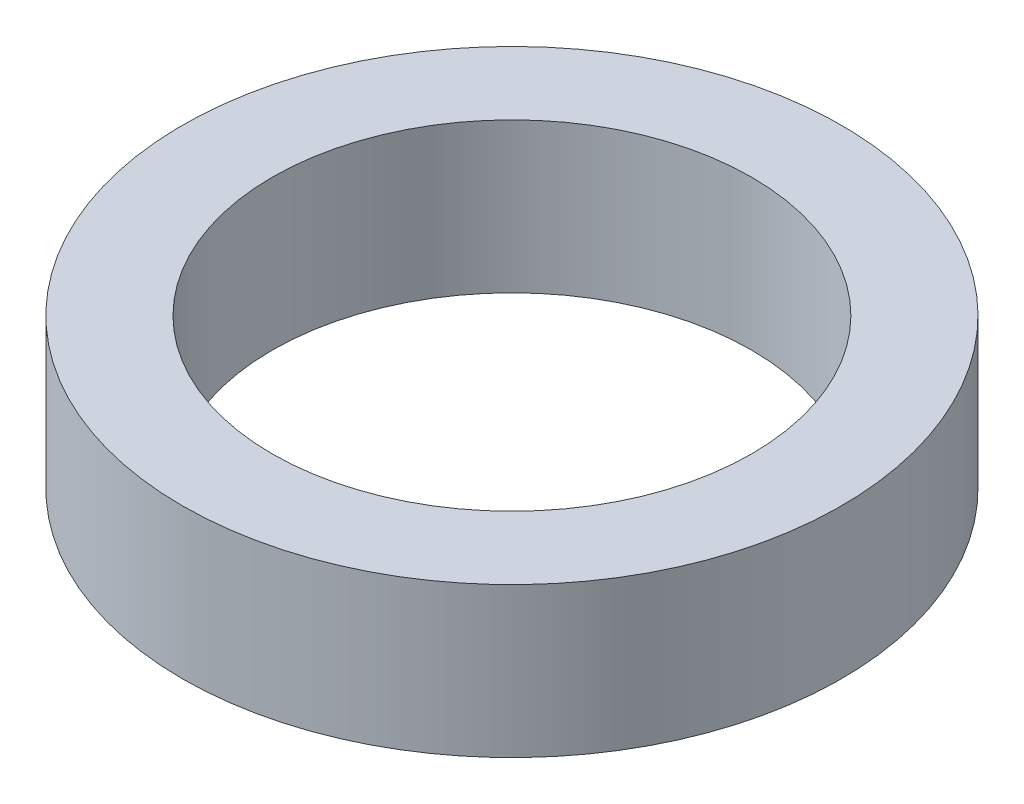
ISO-10303-21;
HEADER;
FILE_DESCRIPTION(('STEP AP214'),'2;1');
FILE_NAME('part.step','',(''),(''),'','','');
FILE_SCHEMA(('AUTOMOTIVE_DESIGN { 1 0 10303 214 1 1 1 1 }'));
ENDSEC;
DATA;
#1=APPLICATION_CONTEXT('core data for automotive mechanical design processes');
#2=APPLICATION_PROTOCOL_DEFINITION('international standard','automotive_design',2000,#1);
#3=PRODUCT_CONTEXT('',#1,'mechanical');
#4=PRODUCT('Part','Part','',(#3));
#5=PRODUCT_RELATED_PRODUCT_CATEGORY('part','',(#4));
#6=PRODUCT_DEFINITION_FORMATION('','',#4);
#7=PRODUCT_DEFINITION_CONTEXT('part definition',#1,'design');
#8=PRODUCT_DEFINITION('design','',#6,#7);
#9=PRODUCT_DEFINITION_SHAPE('','',#8);
#10=(LENGTH_UNIT() NAMED_UNIT(*) SI_UNIT(.MILLI.,.METRE.));
#11=(NAMED_UNIT(*) PLANE_ANGLE_UNIT() SI_UNIT($,.RADIAN.));
#12=(NAMED_UNIT(*) SI_UNIT($,.STERADIAN.) SOLID_ANGLE_UNIT());
#13=UNCERTAINTY_MEASURE_WITH_UNIT(LENGTH_MEASURE(1.E-05),#10,'distance_accuracy_value','');
#14=(GEOMETRIC_REPRESENTATION_CONTEXT(3) GLOBAL_UNCERTAINTY_ASSIGNED_CONTEXT((#13)) GLOBAL_UNIT_ASSIGNED_CONTEXT((#10,
#11,#12)) REPRESENTATION_CONTEXT('',''));
#15=CARTESIAN_POINT('',(0.,0.,0.));
#16=DIRECTION('',(0.,0.,1.));
#17=DIRECTION('',(1.,0.,0.));
#18=AXIS2_PLACEMENT_3D('',#15,#16,#17);
#19=CARTESIAN_POINT('',(0.,5.,0.));
#20=DIRECTION('',(0.,1.,0.));
#21=DIRECTION('',(0.,0.,1.));
#22=AXIS2_PLACEMENT_3D('',#19,#20,#21);
#23=PLANE('',#22);
#24=CARTESIAN_POINT('',(0.,5.,0.));
#25=DIRECTION('',(0.,1.,0.));
#26=DIRECTION('',(0.,0.,1.));
#27=AXIS2_PLACEMENT_3D('',#24,#25,#26);
#28=CIRCLE('',#27,11.);
#29=CARTESIAN_POINT('',(0.,5.,11.));
#30=VERTEX_POINT('',#29);
#31=EDGE_CURVE('E10',#30,#30,#28,.T.);
#32=ORIENTED_EDGE('',*,*,#31,.T.);
#33=EDGE_LOOP('',(#32));
#34=FACE_BOUND('',#33,.T.);
#35=CARTESIAN_POINT('',(0.,5.,0.));
#36=DIRECTION('',(0.,1.,0.));
#37=DIRECTION('',(0.,0.,1.));
#38=AXIS2_PLACEMENT_3D('',#35,#36,#37);
#39=CIRCLE('',#38,8.);
#40=CARTESIAN_POINT('',(0.,5.,8.));
#41=VERTEX_POINT('',#40);
#42=EDGE_CURVE('E49',#41,#41,#39,.T.);
#43=ORIENTED_EDGE('',*,*,#42,.F.);
#44=EDGE_LOOP('',(#43));
#45=FACE_BOUND('',#44,.T.);
#46=ADVANCED_FACE('F38',(#34,#45),#23,.T.);
#47=CARTESIAN_POINT('',(0.,0.,0.));
#48=DIRECTION('',(0.,1.,0.));
#49=DIRECTION('',(0.,0.,1.));
#50=AXIS2_PLACEMENT_3D('',#47,#48,#49);
#51=PLANE('',#50);
#52=CARTESIAN_POINT('',(0.,0.,0.));
#53=DIRECTION('',(0.,1.,0.));
#54=DIRECTION('',(0.,0.,1.));
#55=AXIS2_PLACEMENT_3D('',#52,#53,#54);
#56=CIRCLE('',#55,11.);
#57=CARTESIAN_POINT('',(0.,0.,11.));
#58=VERTEX_POINT('',#57);
#59=EDGE_CURVE('E42',#58,#58,#56,.T.);
#60=ORIENTED_EDGE('',*,*,#59,.F.);
#61=EDGE_LOOP('',(#60));
#62=FACE_BOUND('',#61,.T.);
#63=CARTESIAN_POINT('',(0.,0.,0.));
#64=DIRECTION('',(0.,1.,0.));
#65=DIRECTION('',(0.,0.,1.));
#66=AXIS2_PLACEMENT_3D('',#63,#64,#65);
#67=CIRCLE('',#66,8.);
#68=CARTESIAN_POINT('',(0.,0.,8.));
#69=VERTEX_POINT('',#68);
#70=EDGE_CURVE('E51',#69,#69,#67,.T.);
#71=ORIENTED_EDGE('',*,*,#70,.T.);
#72=EDGE_LOOP('',(#71));
#73=FACE_BOUND('',#72,.T.);
#74=ADVANCED_FACE('F61',(#62,#73),#51,.F.);
#75=CARTESIAN_POINT('',(0.,5.,0.));
#76=DIRECTION('',(0.,-1.,0.));
#77=DIRECTION('',(0.,0.,-1.));
#78=AXIS2_PLACEMENT_3D('',#75,#76,#77);
#79=CYLINDRICAL_SURFACE('',#78,11.);
#80=ORIENTED_EDGE('',*,*,#31,.F.);
#81=EDGE_LOOP('',(#80));
#82=FACE_BOUND('',#81,.T.);
#83=ORIENTED_EDGE('',*,*,#59,.T.);
#84=EDGE_LOOP('',(#83));
#85=FACE_BOUND('',#84,.T.);
#86=ADVANCED_FACE('F40',(#82,#85),#79,.T.);
#87=CARTESIAN_POINT('',(0.,5.,0.));
#88=DIRECTION('',(0.,-1.,0.));
#89=DIRECTION('',(0.,0.,-1.));
#90=AXIS2_PLACEMENT_3D('',#87,#88,#89);
#91=CYLINDRICAL_SURFACE('',#90,8.);
#92=ORIENTED_EDGE('',*,*,#42,.T.);
#93=EDGE_LOOP('',(#92));
#94=FACE_BOUND('',#93,.T.);
#95=ORIENTED_EDGE('',*,*,#70,.F.);
#96=EDGE_LOOP('',(#95));
#97=FACE_BOUND('',#96,.T.);
#98=ADVANCED_FACE('F57',(#94,#97),#91,.F.);
#99=CLOSED_SHELL('',(#46,#74,#86,#98));
#100=MANIFOLD_SOLID_BREP('B2',#99);
#101=ADVANCED_BREP_SHAPE_REPRESENTATION('',(#18,#100),#14);
#102=SHAPE_DEFINITION_REPRESENTATION(#9,#101);
ENDSEC;
END-ISO-10303-21;
